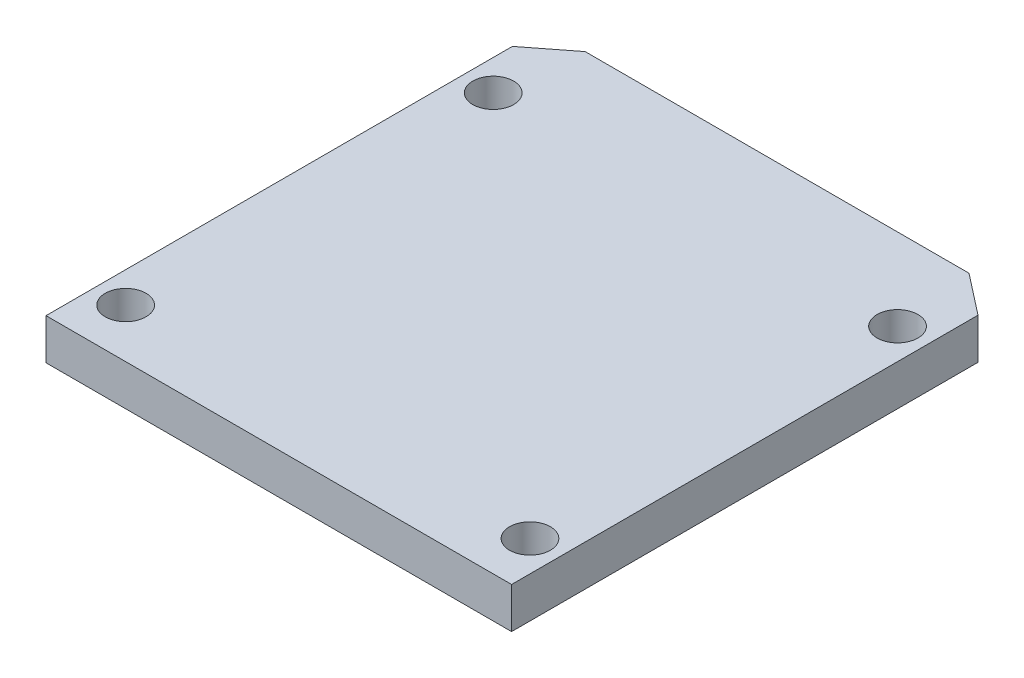
ISO-10303-21;
HEADER;
FILE_DESCRIPTION(('STEP AP214'),'2;1');
FILE_NAME('part.step','',(''),(''),'','','');
FILE_SCHEMA(('AUTOMOTIVE_DESIGN { 1 0 10303 214 1 1 1 1 }'));
ENDSEC;
DATA;
#1=APPLICATION_CONTEXT('core data for automotive mechanical design processes');
#2=APPLICATION_PROTOCOL_DEFINITION('international standard','automotive_design',2000,#1);
#3=PRODUCT_CONTEXT('',#1,'mechanical');
#4=PRODUCT('Part','Part','',(#3));
#5=PRODUCT_RELATED_PRODUCT_CATEGORY('part','',(#4));
#6=PRODUCT_DEFINITION_FORMATION('','',#4);
#7=PRODUCT_DEFINITION_CONTEXT('part definition',#1,'design');
#8=PRODUCT_DEFINITION('design','',#6,#7);
#9=PRODUCT_DEFINITION_SHAPE('','',#8);
#10=(LENGTH_UNIT() NAMED_UNIT(*) SI_UNIT(.MILLI.,.METRE.));
#11=(NAMED_UNIT(*) PLANE_ANGLE_UNIT() SI_UNIT($,.RADIAN.));
#12=(NAMED_UNIT(*) SI_UNIT($,.STERADIAN.) SOLID_ANGLE_UNIT());
#13=UNCERTAINTY_MEASURE_WITH_UNIT(LENGTH_MEASURE(1.E-05),#10,'distance_accuracy_value','');
#14=(GEOMETRIC_REPRESENTATION_CONTEXT(3) GLOBAL_UNCERTAINTY_ASSIGNED_CONTEXT((#13)) GLOBAL_UNIT_ASSIGNED_CONTEXT((#10,
#11,#12)) REPRESENTATION_CONTEXT('',''));
#15=CARTESIAN_POINT('',(0.,0.,0.));
#16=DIRECTION('',(0.,0.,1.));
#17=DIRECTION('',(1.,0.,0.));
#18=AXIS2_PLACEMENT_3D('',#15,#16,#17);
#19=CARTESIAN_POINT('',(0.,5.,0.));
#20=DIRECTION('',(0.,-1.,0.));
#21=DIRECTION('',(0.,0.,-1.));
#22=AXIS2_PLACEMENT_3D('',#19,#20,#21);
#23=PLANE('',#22);
#24=CARTESIAN_POINT('',(-21.3779434850863,5.,-0.790109890109892));
#25=DIRECTION('',(0.,1.,0.));
#26=DIRECTION('',(0.,0.,1.));
#27=AXIS2_PLACEMENT_3D('',#24,#25,#26);
#28=CIRCLE('',#27,2.49999999999999);
#29=CARTESIAN_POINT('',(-21.3779434850863,5.,1.7098901098901));
#30=VERTEX_POINT('',#29);
#31=EDGE_CURVE('E146',#30,#30,#28,.T.);
#32=ORIENTED_EDGE('',*,*,#31,.F.);
#33=EDGE_LOOP('',(#32));
#34=FACE_BOUND('',#33,.T.);
#35=CARTESIAN_POINT('',(-21.3779434850863,5.,44.2098901098901));
#36=DIRECTION('',(0.,1.,0.));
#37=DIRECTION('',(0.,0.,1.));
#38=AXIS2_PLACEMENT_3D('',#35,#36,#37);
#39=CIRCLE('',#38,2.49999999999999);
#40=CARTESIAN_POINT('',(-21.3779434850863,5.,46.7098901098901));
#41=VERTEX_POINT('',#40);
#42=EDGE_CURVE('E140',#41,#41,#39,.T.);
#43=ORIENTED_EDGE('',*,*,#42,.F.);
#44=EDGE_LOOP('',(#43));
#45=FACE_BOUND('',#44,.T.);
#46=CARTESIAN_POINT('',(28.1220565149137,5.,44.2098901098901));
#47=DIRECTION('',(0.,1.,0.));
#48=DIRECTION('',(0.,0.,1.));
#49=AXIS2_PLACEMENT_3D('',#46,#47,#48);
#50=CIRCLE('',#49,2.49999999999999);
#51=CARTESIAN_POINT('',(28.1220565149137,5.,46.7098901098901));
#52=VERTEX_POINT('',#51);
#53=EDGE_CURVE('E134',#52,#52,#50,.T.);
#54=ORIENTED_EDGE('',*,*,#53,.F.);
#55=EDGE_LOOP('',(#54));
#56=FACE_BOUND('',#55,.T.);
#57=CARTESIAN_POINT('',(28.1220565149137,5.,-0.790109890109892));
#58=DIRECTION('',(0.,1.,0.));
#59=DIRECTION('',(0.,0.,1.));
#60=AXIS2_PLACEMENT_3D('',#57,#58,#59);
#61=CIRCLE('',#60,2.49999999999999);
#62=CARTESIAN_POINT('',(28.1220565149137,5.,1.7098901098901));
#63=VERTEX_POINT('',#62);
#64=EDGE_CURVE('E122',#63,#63,#61,.T.);
#65=ORIENTED_EDGE('',*,*,#64,.F.);
#66=EDGE_LOOP('',(#65));
#67=FACE_BOUND('',#66,.T.);
#68=DIRECTION('',(0.999999999995422,0.,-3.02580216912772E-06));
#69=VECTOR('',#68,1.);
#70=CARTESIAN_POINT('',(-3.26486089862201E-05,5.,-10.7900672817227));
#71=LINE('',#70,#69);
#72=CARTESIAN_POINT('',(-20.1280346478323,5.,-10.7900063783706));
#73=VERTEX_POINT('',#72);
#74=CARTESIAN_POINT('',(26.8719653521677,5.,-10.7901485910726));
#75=VERTEX_POINT('',#74);
#76=EDGE_CURVE('E166',#73,#75,#71,.T.);
#77=ORIENTED_EDGE('',*,*,#76,.F.);
#78=DIRECTION('',(0.788504784301229,0.,-0.615028621394217));
#79=VECTOR('',#78,1.);
#80=CARTESIAN_POINT('',(-12.8462805908168,5.,-16.4697273492292));
#81=LINE('',#80,#79);
#82=CARTESIAN_POINT('',(-25.1279434850863,5.,-6.89010989010989));
#83=VERTEX_POINT('',#82);
#84=EDGE_CURVE('E159',#83,#73,#81,.T.);
#85=ORIENTED_EDGE('',*,*,#84,.F.);
#86=DIRECTION('',(0.,0.,1.));
#87=VECTOR('',#86,1.);
#88=CARTESIAN_POINT('',(-25.1279434850863,5.,-11.8901098901099));
#89=LINE('',#88,#87);
#90=CARTESIAN_POINT('',(-25.1279434850863,5.,50.2098901098901));
#91=VERTEX_POINT('',#90);
#92=EDGE_CURVE('E87',#83,#91,#89,.T.);
#93=ORIENTED_EDGE('',*,*,#92,.T.);
#94=DIRECTION('',(1.,0.,0.));
#95=VECTOR('',#94,1.);
#96=CARTESIAN_POINT('',(-25.1279434850863,5.,50.2098901098901));
#97=LINE('',#96,#95);
#98=CARTESIAN_POINT('',(31.8720565149136,5.,50.2098901098901));
#99=VERTEX_POINT('',#98);
#100=EDGE_CURVE('E107',#91,#99,#97,.T.);
#101=ORIENTED_EDGE('',*,*,#100,.T.);
#102=DIRECTION('',(0.,0.,1.));
#103=VECTOR('',#102,1.);
#104=CARTESIAN_POINT('',(31.8720565149137,5.,-11.8901098901099));
#105=LINE('',#104,#103);
#106=CARTESIAN_POINT('',(31.8720565149137,5.,-6.89010989010989));
#107=VERTEX_POINT('',#106);
#108=EDGE_CURVE('E126',#107,#99,#105,.T.);
#109=ORIENTED_EDGE('',*,*,#108,.F.);
#110=DIRECTION('',(0.788504784301229,0.,0.615028621394218));
#111=VECTOR('',#110,1.);
#112=CARTESIAN_POINT('',(15.3973101689266,5.,-19.7403052658693));
#113=LINE('',#112,#111);
#114=EDGE_CURVE('E163',#75,#107,#113,.T.);
#115=ORIENTED_EDGE('',*,*,#114,.F.);
#116=EDGE_LOOP('',(#77,#85,#93,#101,#109,#115));
#117=FACE_BOUND('',#116,.T.);
#118=ADVANCED_FACE('F63',(#34,#45,#56,#67,#117),#23,.F.);
#119=CARTESIAN_POINT('',(0.,0.,0.));
#120=DIRECTION('',(0.,-1.,0.));
#121=DIRECTION('',(0.,0.,-1.));
#122=AXIS2_PLACEMENT_3D('',#119,#120,#121);
#123=PLANE('',#122);
#124=DIRECTION('',(0.788504784301229,0.,-0.615028621394217));
#125=VECTOR('',#124,1.);
#126=CARTESIAN_POINT('',(-12.8462805908168,0.,-16.4697273492292));
#127=LINE('',#126,#125);
#128=CARTESIAN_POINT('',(-25.1279434850863,0.,-6.89010989010989));
#129=VERTEX_POINT('',#128);
#130=CARTESIAN_POINT('',(-20.1280346478323,0.,-10.7900063783706));
#131=VERTEX_POINT('',#130);
#132=EDGE_CURVE('E78',#129,#131,#127,.T.);
#133=ORIENTED_EDGE('',*,*,#132,.T.);
#134=DIRECTION('',(0.999999999995422,0.,-3.02580216912772E-06));
#135=VECTOR('',#134,1.);
#136=CARTESIAN_POINT('',(-3.26486089862201E-05,0.,-10.7900672817227));
#137=LINE('',#136,#135);
#138=CARTESIAN_POINT('',(26.8719653521677,0.,-10.7901485910726));
#139=VERTEX_POINT('',#138);
#140=EDGE_CURVE('E162',#131,#139,#137,.T.);
#141=ORIENTED_EDGE('',*,*,#140,.T.);
#142=DIRECTION('',(0.788504784301229,0.,0.615028621394218));
#143=VECTOR('',#142,1.);
#144=CARTESIAN_POINT('',(15.3973101689266,0.,-19.7403052658693));
#145=LINE('',#144,#143);
#146=CARTESIAN_POINT('',(31.8720565149137,0.,-6.89010989010989));
#147=VERTEX_POINT('',#146);
#148=EDGE_CURVE('E170',#139,#147,#145,.T.);
#149=ORIENTED_EDGE('',*,*,#148,.T.);
#150=DIRECTION('',(0.,0.,1.));
#151=VECTOR('',#150,1.);
#152=CARTESIAN_POINT('',(31.8720565149137,0.,-11.8901098901099));
#153=LINE('',#152,#151);
#154=CARTESIAN_POINT('',(31.8720565149136,0.,50.2098901098901));
#155=VERTEX_POINT('',#154);
#156=EDGE_CURVE('E108',#147,#155,#153,.T.);
#157=ORIENTED_EDGE('',*,*,#156,.T.);
#158=DIRECTION('',(1.,0.,0.));
#159=VECTOR('',#158,1.);
#160=CARTESIAN_POINT('',(-25.1279434850863,0.,50.2098901098901));
#161=LINE('',#160,#159);
#162=CARTESIAN_POINT('',(-25.1279434850863,0.,50.2098901098901));
#163=VERTEX_POINT('',#162);
#164=EDGE_CURVE('E113',#163,#155,#161,.T.);
#165=ORIENTED_EDGE('',*,*,#164,.F.);
#166=DIRECTION('',(0.,0.,1.));
#167=VECTOR('',#166,1.);
#168=CARTESIAN_POINT('',(-25.1279434850863,0.,-11.8901098901099));
#169=LINE('',#168,#167);
#170=EDGE_CURVE('E100',#129,#163,#169,.T.);
#171=ORIENTED_EDGE('',*,*,#170,.F.);
#172=EDGE_LOOP('',(#133,#141,#149,#157,#165,#171));
#173=FACE_BOUND('',#172,.T.);
#174=CARTESIAN_POINT('',(-21.3779434850863,0.,-0.790109890109892));
#175=DIRECTION('',(0.,1.,0.));
#176=DIRECTION('',(0.,0.,1.));
#177=AXIS2_PLACEMENT_3D('',#174,#175,#176);
#178=CIRCLE('',#177,2.5);
#179=CARTESIAN_POINT('',(-21.3779434850863,0.,1.70989010989011));
#180=VERTEX_POINT('',#179);
#181=EDGE_CURVE('E143',#180,#180,#178,.T.);
#182=ORIENTED_EDGE('',*,*,#181,.T.);
#183=EDGE_LOOP('',(#182));
#184=FACE_BOUND('',#183,.T.);
#185=CARTESIAN_POINT('',(-21.3779434850863,0.,44.2098901098901));
#186=DIRECTION('',(0.,1.,0.));
#187=DIRECTION('',(0.,0.,1.));
#188=AXIS2_PLACEMENT_3D('',#185,#186,#187);
#189=CIRCLE('',#188,2.5);
#190=CARTESIAN_POINT('',(-21.3779434850863,0.,46.7098901098901));
#191=VERTEX_POINT('',#190);
#192=EDGE_CURVE('E137',#191,#191,#189,.T.);
#193=ORIENTED_EDGE('',*,*,#192,.T.);
#194=EDGE_LOOP('',(#193));
#195=FACE_BOUND('',#194,.T.);
#196=CARTESIAN_POINT('',(28.1220565149137,0.,44.2098901098901));
#197=DIRECTION('',(0.,1.,0.));
#198=DIRECTION('',(0.,0.,1.));
#199=AXIS2_PLACEMENT_3D('',#196,#197,#198);
#200=CIRCLE('',#199,2.5);
#201=CARTESIAN_POINT('',(28.1220565149137,0.,46.7098901098901));
#202=VERTEX_POINT('',#201);
#203=EDGE_CURVE('E131',#202,#202,#200,.T.);
#204=ORIENTED_EDGE('',*,*,#203,.T.);
#205=EDGE_LOOP('',(#204));
#206=FACE_BOUND('',#205,.T.);
#207=CARTESIAN_POINT('',(28.1220565149137,0.,-0.790109890109892));
#208=DIRECTION('',(0.,1.,0.));
#209=DIRECTION('',(0.,0.,1.));
#210=AXIS2_PLACEMENT_3D('',#207,#208,#209);
#211=CIRCLE('',#210,2.5);
#212=CARTESIAN_POINT('',(28.1220565149137,0.,1.70989010989011));
#213=VERTEX_POINT('',#212);
#214=EDGE_CURVE('E118',#213,#213,#211,.T.);
#215=ORIENTED_EDGE('',*,*,#214,.T.);
#216=EDGE_LOOP('',(#215));
#217=FACE_BOUND('',#216,.T.);
#218=ADVANCED_FACE('F114',(#173,#184,#195,#206,#217),#123,.T.);
#219=CARTESIAN_POINT('',(-25.1279434850863,5.,50.2098901098901));
#220=DIRECTION('',(0.,0.,-1.));
#221=DIRECTION('',(-1.,0.,0.));
#222=AXIS2_PLACEMENT_3D('',#219,#220,#221);
#223=PLANE('',#222);
#224=ORIENTED_EDGE('',*,*,#164,.T.);
#225=DIRECTION('',(0.,-1.,0.));
#226=VECTOR('',#225,1.);
#227=CARTESIAN_POINT('',(31.8720565149136,5.,50.2098901098901));
#228=LINE('',#227,#226);
#229=EDGE_CURVE('E12',#99,#155,#228,.T.);
#230=ORIENTED_EDGE('',*,*,#229,.F.);
#231=ORIENTED_EDGE('',*,*,#100,.F.);
#232=DIRECTION('',(0.,-1.,0.));
#233=VECTOR('',#232,1.);
#234=CARTESIAN_POINT('',(-25.1279434850863,5.,50.2098901098901));
#235=LINE('',#234,#233);
#236=EDGE_CURVE('E71',#91,#163,#235,.T.);
#237=ORIENTED_EDGE('',*,*,#236,.T.);
#238=EDGE_LOOP('',(#224,#230,#231,#237));
#239=FACE_BOUND('',#238,.T.);
#240=ADVANCED_FACE('F65',(#239),#223,.F.);
#241=CARTESIAN_POINT('',(31.8720565149137,5.,-11.8901098901099));
#242=DIRECTION('',(1.,0.,0.));
#243=DIRECTION('',(0.,0.,-1.));
#244=AXIS2_PLACEMENT_3D('',#241,#242,#243);
#245=PLANE('',#244);
#246=DIRECTION('',(0.,1.,0.));
#247=VECTOR('',#246,1.);
#248=CARTESIAN_POINT('',(31.8720565149137,0.,-6.89010989010989));
#249=LINE('',#248,#247);
#250=EDGE_CURVE('E153',#147,#107,#249,.T.);
#251=ORIENTED_EDGE('',*,*,#250,.T.);
#252=ORIENTED_EDGE('',*,*,#108,.T.);
#253=ORIENTED_EDGE('',*,*,#229,.T.);
#254=ORIENTED_EDGE('',*,*,#156,.F.);
#255=EDGE_LOOP('',(#251,#252,#253,#254));
#256=FACE_BOUND('',#255,.T.);
#257=ADVANCED_FACE('F198',(#256),#245,.T.);
#258=CARTESIAN_POINT('',(-25.1279434850863,5.,-11.8901098901099));
#259=DIRECTION('',(1.,0.,0.));
#260=DIRECTION('',(0.,0.,-1.));
#261=AXIS2_PLACEMENT_3D('',#258,#259,#260);
#262=PLANE('',#261);
#263=ORIENTED_EDGE('',*,*,#92,.F.);
#264=DIRECTION('',(0.,1.,0.));
#265=VECTOR('',#264,1.);
#266=CARTESIAN_POINT('',(-25.1279434850863,0.,-6.89010989010989));
#267=LINE('',#266,#265);
#268=EDGE_CURVE('E104',#129,#83,#267,.T.);
#269=ORIENTED_EDGE('',*,*,#268,.F.);
#270=ORIENTED_EDGE('',*,*,#170,.T.);
#271=ORIENTED_EDGE('',*,*,#236,.F.);
#272=EDGE_LOOP('',(#263,#269,#270,#271));
#273=FACE_BOUND('',#272,.T.);
#274=ADVANCED_FACE('F102',(#273),#262,.F.);
#275=CARTESIAN_POINT('',(28.1220565149137,5.,-0.790109890109892));
#276=DIRECTION('',(0.,1.,0.));
#277=DIRECTION('',(0.,0.,1.));
#278=AXIS2_PLACEMENT_3D('',#275,#276,#277);
#279=CYLINDRICAL_SURFACE('',#278,2.49999999999999);
#280=ORIENTED_EDGE('',*,*,#214,.F.);
#281=EDGE_LOOP('',(#280));
#282=FACE_BOUND('',#281,.T.);
#283=ORIENTED_EDGE('',*,*,#64,.T.);
#284=EDGE_LOOP('',(#283));
#285=FACE_BOUND('',#284,.T.);
#286=ADVANCED_FACE('F204',(#282,#285),#279,.F.);
#287=CARTESIAN_POINT('',(28.1220565149137,5.,44.2098901098901));
#288=DIRECTION('',(0.,1.,0.));
#289=DIRECTION('',(0.,0.,1.));
#290=AXIS2_PLACEMENT_3D('',#287,#288,#289);
#291=CYLINDRICAL_SURFACE('',#290,2.49999999999999);
#292=ORIENTED_EDGE('',*,*,#203,.F.);
#293=EDGE_LOOP('',(#292));
#294=FACE_BOUND('',#293,.T.);
#295=ORIENTED_EDGE('',*,*,#53,.T.);
#296=EDGE_LOOP('',(#295));
#297=FACE_BOUND('',#296,.T.);
#298=ADVANCED_FACE('F218',(#294,#297),#291,.F.);
#299=CARTESIAN_POINT('',(-21.3779434850863,5.,44.2098901098901));
#300=DIRECTION('',(0.,1.,0.));
#301=DIRECTION('',(0.,0.,1.));
#302=AXIS2_PLACEMENT_3D('',#299,#300,#301);
#303=CYLINDRICAL_SURFACE('',#302,2.49999999999999);
#304=ORIENTED_EDGE('',*,*,#192,.F.);
#305=EDGE_LOOP('',(#304));
#306=FACE_BOUND('',#305,.T.);
#307=ORIENTED_EDGE('',*,*,#42,.T.);
#308=EDGE_LOOP('',(#307));
#309=FACE_BOUND('',#308,.T.);
#310=ADVANCED_FACE('F222',(#306,#309),#303,.F.);
#311=CARTESIAN_POINT('',(-21.3779434850863,5.,-0.790109890109892));
#312=DIRECTION('',(0.,1.,0.));
#313=DIRECTION('',(0.,0.,1.));
#314=AXIS2_PLACEMENT_3D('',#311,#312,#313);
#315=CYLINDRICAL_SURFACE('',#314,2.49999999999999);
#316=ORIENTED_EDGE('',*,*,#181,.F.);
#317=EDGE_LOOP('',(#316));
#318=FACE_BOUND('',#317,.T.);
#319=ORIENTED_EDGE('',*,*,#31,.T.);
#320=EDGE_LOOP('',(#319));
#321=FACE_BOUND('',#320,.T.);
#322=ADVANCED_FACE('F226',(#318,#321),#315,.F.);
#323=CARTESIAN_POINT('',(-3.26486089862201E-05,0.,-10.7900672817227));
#324=DIRECTION('',(3.02580216912772E-06,0.,0.999999999995422));
#325=DIRECTION('',(0.999999999995422,0.,-3.02580216912772E-06));
#326=AXIS2_PLACEMENT_3D('',#323,#324,#325);
#327=PLANE('',#326);
#328=ORIENTED_EDGE('',*,*,#76,.T.);
#329=DIRECTION('',(0.,1.,0.));
#330=VECTOR('',#329,1.);
#331=CARTESIAN_POINT('',(26.8719653521677,0.,-10.7901485910726));
#332=LINE('',#331,#330);
#333=EDGE_CURVE('E150',#139,#75,#332,.T.);
#334=ORIENTED_EDGE('',*,*,#333,.F.);
#335=ORIENTED_EDGE('',*,*,#140,.F.);
#336=DIRECTION('',(0.,1.,0.));
#337=VECTOR('',#336,1.);
#338=CARTESIAN_POINT('',(-20.1280346478323,0.,-10.7900063783706));
#339=LINE('',#338,#337);
#340=EDGE_CURVE('E149',#131,#73,#339,.T.);
#341=ORIENTED_EDGE('',*,*,#340,.T.);
#342=EDGE_LOOP('',(#328,#334,#335,#341));
#343=FACE_BOUND('',#342,.T.);
#344=ADVANCED_FACE('F181',(#343),#327,.F.);
#345=CARTESIAN_POINT('',(-12.8462805908168,0.,-16.4697273492292));
#346=DIRECTION('',(0.615028621394217,0.,0.788504784301229));
#347=DIRECTION('',(0.788504784301229,0.,-0.615028621394217));
#348=AXIS2_PLACEMENT_3D('',#345,#346,#347);
#349=PLANE('',#348);
#350=ORIENTED_EDGE('',*,*,#84,.T.);
#351=ORIENTED_EDGE('',*,*,#340,.F.);
#352=ORIENTED_EDGE('',*,*,#132,.F.);
#353=ORIENTED_EDGE('',*,*,#268,.T.);
#354=EDGE_LOOP('',(#350,#351,#352,#353));
#355=FACE_BOUND('',#354,.T.);
#356=ADVANCED_FACE('F191',(#355),#349,.F.);
#357=CARTESIAN_POINT('',(15.3973101689266,0.,-19.7403052658693));
#358=DIRECTION('',(-0.615028621394218,0.,0.788504784301229));
#359=DIRECTION('',(0.788504784301229,0.,0.615028621394218));
#360=AXIS2_PLACEMENT_3D('',#357,#358,#359);
#361=PLANE('',#360);
#362=ORIENTED_EDGE('',*,*,#114,.T.);
#363=ORIENTED_EDGE('',*,*,#250,.F.);
#364=ORIENTED_EDGE('',*,*,#148,.F.);
#365=ORIENTED_EDGE('',*,*,#333,.T.);
#366=EDGE_LOOP('',(#362,#363,#364,#365));
#367=FACE_BOUND('',#366,.T.);
#368=ADVANCED_FACE('F196',(#367),#361,.F.);
#369=CLOSED_SHELL('',(#118,#218,#240,#257,#274,#286,#298,#310,#322,#344,#356,#368));
#370=MANIFOLD_SOLID_BREP('B2',#369);
#371=ADVANCED_BREP_SHAPE_REPRESENTATION('',(#18,#370),#14);
#372=SHAPE_DEFINITION_REPRESENTATION(#9,#371);
ENDSEC;
END-ISO-10303-21;
